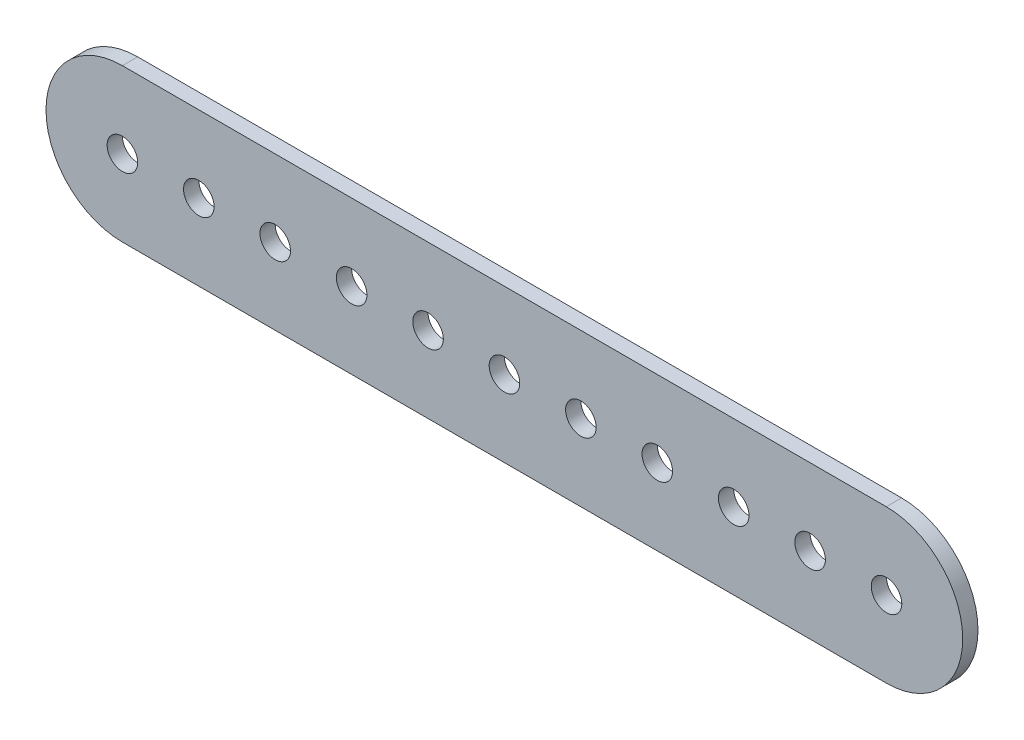
ISO-10303-21;
HEADER;
FILE_DESCRIPTION(('STEP AP214'),'2;1');
FILE_NAME('part.step','',(''),(''),'','','');
FILE_SCHEMA(('AUTOMOTIVE_DESIGN { 1 0 10303 214 1 1 1 1 }'));
ENDSEC;
DATA;
#1=APPLICATION_CONTEXT('core data for automotive mechanical design processes');
#2=APPLICATION_PROTOCOL_DEFINITION('international standard','automotive_design',2000,#1);
#3=PRODUCT_CONTEXT('',#1,'mechanical');
#4=PRODUCT('Part','Part','',(#3));
#5=PRODUCT_RELATED_PRODUCT_CATEGORY('part','',(#4));
#6=PRODUCT_DEFINITION_FORMATION('','',#4);
#7=PRODUCT_DEFINITION_CONTEXT('part definition',#1,'design');
#8=PRODUCT_DEFINITION('design','',#6,#7);
#9=PRODUCT_DEFINITION_SHAPE('','',#8);
#10=(LENGTH_UNIT() NAMED_UNIT(*) SI_UNIT(.MILLI.,.METRE.));
#11=(NAMED_UNIT(*) PLANE_ANGLE_UNIT() SI_UNIT($,.RADIAN.));
#12=(NAMED_UNIT(*) SI_UNIT($,.STERADIAN.) SOLID_ANGLE_UNIT());
#13=UNCERTAINTY_MEASURE_WITH_UNIT(LENGTH_MEASURE(1.E-05),#10,'distance_accuracy_value','');
#14=(GEOMETRIC_REPRESENTATION_CONTEXT(3) GLOBAL_UNCERTAINTY_ASSIGNED_CONTEXT((#13)) GLOBAL_UNIT_ASSIGNED_CONTEXT((#10,
#11,#12)) REPRESENTATION_CONTEXT('',''));
#15=CARTESIAN_POINT('',(0.,0.,0.));
#16=DIRECTION('',(0.,0.,1.));
#17=DIRECTION('',(1.,0.,0.));
#18=AXIS2_PLACEMENT_3D('',#15,#16,#17);
#19=CARTESIAN_POINT('',(0.,0.,100.));
#20=DIRECTION('',(0.,0.,1.));
#21=DIRECTION('',(1.,0.,0.));
#22=AXIS2_PLACEMENT_3D('',#19,#20,#21);
#23=PLANE('',#22);
#24=CARTESIAN_POINT('',(4501.134,0.,100.));
#25=DIRECTION('',(0.,0.,1.));
#26=DIRECTION('',(1.,0.,0.));
#27=AXIS2_PLACEMENT_3D('',#24,#25,#26);
#28=CIRCLE('',#27,100.);
#29=CARTESIAN_POINT('',(4601.134,0.,100.));
#30=VERTEX_POINT('',#29);
#31=EDGE_CURVE('E202',#30,#30,#28,.T.);
#32=ORIENTED_EDGE('',*,*,#31,.F.);
#33=EDGE_LOOP('',(#32));
#34=FACE_BOUND('',#33,.T.);
#35=CARTESIAN_POINT('',(3500.882,0.,100.));
#36=DIRECTION('',(0.,0.,1.));
#37=DIRECTION('',(1.,0.,0.));
#38=AXIS2_PLACEMENT_3D('',#35,#36,#37);
#39=CIRCLE('',#38,100.);
#40=CARTESIAN_POINT('',(3600.882,0.,100.));
#41=VERTEX_POINT('',#40);
#42=EDGE_CURVE('E186',#41,#41,#39,.T.);
#43=ORIENTED_EDGE('',*,*,#42,.F.);
#44=EDGE_LOOP('',(#43));
#45=FACE_BOUND('',#44,.T.);
#46=CARTESIAN_POINT('',(2500.63,0.,100.));
#47=DIRECTION('',(0.,0.,1.));
#48=DIRECTION('',(1.,0.,0.));
#49=AXIS2_PLACEMENT_3D('',#46,#47,#48);
#50=CIRCLE('',#49,100.);
#51=CARTESIAN_POINT('',(2600.63,0.,100.));
#52=VERTEX_POINT('',#51);
#53=EDGE_CURVE('E170',#52,#52,#50,.T.);
#54=ORIENTED_EDGE('',*,*,#53,.F.);
#55=EDGE_LOOP('',(#54));
#56=FACE_BOUND('',#55,.T.);
#57=CARTESIAN_POINT('',(1500.378,0.,100.));
#58=DIRECTION('',(0.,0.,1.));
#59=DIRECTION('',(1.,0.,0.));
#60=AXIS2_PLACEMENT_3D('',#57,#58,#59);
#61=CIRCLE('',#60,100.);
#62=CARTESIAN_POINT('',(1600.378,0.,100.));
#63=VERTEX_POINT('',#62);
#64=EDGE_CURVE('E154',#63,#63,#61,.T.);
#65=ORIENTED_EDGE('',*,*,#64,.F.);
#66=EDGE_LOOP('',(#65));
#67=FACE_BOUND('',#66,.T.);
#68=CARTESIAN_POINT('',(500.126,0.,100.));
#69=DIRECTION('',(0.,0.,1.));
#70=DIRECTION('',(1.,0.,0.));
#71=AXIS2_PLACEMENT_3D('',#68,#69,#70);
#72=CIRCLE('',#71,100.);
#73=CARTESIAN_POINT('',(600.126,0.,100.));
#74=VERTEX_POINT('',#73);
#75=EDGE_CURVE('E138',#74,#74,#72,.T.);
#76=ORIENTED_EDGE('',*,*,#75,.F.);
#77=EDGE_LOOP('',(#76));
#78=FACE_BOUND('',#77,.T.);
#79=CARTESIAN_POINT('',(0.,0.,100.));
#80=DIRECTION('',(0.,0.,1.));
#81=DIRECTION('',(1.,0.,0.));
#82=AXIS2_PLACEMENT_3D('',#79,#80,#81);
#83=CIRCLE('',#82,500.);
#84=CARTESIAN_POINT('',(0.,500.,100.));
#85=VERTEX_POINT('',#84);
#86=CARTESIAN_POINT('',(0.,-500.,100.));
#87=VERTEX_POINT('',#86);
#88=EDGE_CURVE('E96',#85,#87,#83,.T.);
#89=ORIENTED_EDGE('',*,*,#88,.T.);
#90=DIRECTION('',(1.,0.,0.));
#91=VECTOR('',#90,1.);
#92=CARTESIAN_POINT('',(0.,-500.,100.));
#93=LINE('',#92,#91);
#94=CARTESIAN_POINT('',(5000.,-500.,100.));
#95=VERTEX_POINT('',#94);
#96=EDGE_CURVE('E91',#87,#95,#93,.T.);
#97=ORIENTED_EDGE('',*,*,#96,.T.);
#98=CARTESIAN_POINT('',(5000.,0.,100.));
#99=DIRECTION('',(0.,0.,1.));
#100=DIRECTION('',(1.,0.,0.));
#101=AXIS2_PLACEMENT_3D('',#98,#99,#100);
#102=CIRCLE('',#101,500.);
#103=CARTESIAN_POINT('',(5000.,500.,100.));
#104=VERTEX_POINT('',#103);
#105=EDGE_CURVE('E94',#95,#104,#102,.T.);
#106=ORIENTED_EDGE('',*,*,#105,.T.);
#107=DIRECTION('',(-1.,0.,0.));
#108=VECTOR('',#107,1.);
#109=CARTESIAN_POINT('',(0.,500.,100.));
#110=LINE('',#109,#108);
#111=EDGE_CURVE('E61',#104,#85,#110,.T.);
#112=ORIENTED_EDGE('',*,*,#111,.T.);
#113=EDGE_LOOP('',(#89,#97,#106,#112));
#114=FACE_BOUND('',#113,.T.);
#115=CARTESIAN_POINT('',(0.,0.,100.));
#116=DIRECTION('',(0.,0.,1.));
#117=DIRECTION('',(1.,0.,0.));
#118=AXIS2_PLACEMENT_3D('',#115,#116,#117);
#119=CIRCLE('',#118,100.);
#120=CARTESIAN_POINT('',(100.,0.,100.));
#121=VERTEX_POINT('',#120);
#122=EDGE_CURVE('E116',#121,#121,#119,.T.);
#123=ORIENTED_EDGE('',*,*,#122,.F.);
#124=EDGE_LOOP('',(#123));
#125=FACE_BOUND('',#124,.T.);
#126=CARTESIAN_POINT('',(1000.252,0.,100.));
#127=DIRECTION('',(0.,0.,1.));
#128=DIRECTION('',(1.,0.,0.));
#129=AXIS2_PLACEMENT_3D('',#126,#127,#128);
#130=CIRCLE('',#129,100.);
#131=CARTESIAN_POINT('',(1100.252,0.,100.));
#132=VERTEX_POINT('',#131);
#133=EDGE_CURVE('E146',#132,#132,#130,.T.);
#134=ORIENTED_EDGE('',*,*,#133,.F.);
#135=EDGE_LOOP('',(#134));
#136=FACE_BOUND('',#135,.T.);
#137=CARTESIAN_POINT('',(2000.504,0.,100.));
#138=DIRECTION('',(0.,0.,1.));
#139=DIRECTION('',(1.,0.,0.));
#140=AXIS2_PLACEMENT_3D('',#137,#138,#139);
#141=CIRCLE('',#140,100.);
#142=CARTESIAN_POINT('',(2100.504,0.,100.));
#143=VERTEX_POINT('',#142);
#144=EDGE_CURVE('E162',#143,#143,#141,.T.);
#145=ORIENTED_EDGE('',*,*,#144,.F.);
#146=EDGE_LOOP('',(#145));
#147=FACE_BOUND('',#146,.T.);
#148=CARTESIAN_POINT('',(3000.756,0.,100.));
#149=DIRECTION('',(0.,0.,1.));
#150=DIRECTION('',(1.,0.,0.));
#151=AXIS2_PLACEMENT_3D('',#148,#149,#150);
#152=CIRCLE('',#151,100.);
#153=CARTESIAN_POINT('',(3100.756,0.,100.));
#154=VERTEX_POINT('',#153);
#155=EDGE_CURVE('E178',#154,#154,#152,.T.);
#156=ORIENTED_EDGE('',*,*,#155,.F.);
#157=EDGE_LOOP('',(#156));
#158=FACE_BOUND('',#157,.T.);
#159=CARTESIAN_POINT('',(4001.008,0.,100.));
#160=DIRECTION('',(0.,0.,1.));
#161=DIRECTION('',(1.,0.,0.));
#162=AXIS2_PLACEMENT_3D('',#159,#160,#161);
#163=CIRCLE('',#162,100.);
#164=CARTESIAN_POINT('',(4101.008,0.,100.));
#165=VERTEX_POINT('',#164);
#166=EDGE_CURVE('E194',#165,#165,#163,.T.);
#167=ORIENTED_EDGE('',*,*,#166,.F.);
#168=EDGE_LOOP('',(#167));
#169=FACE_BOUND('',#168,.T.);
#170=CARTESIAN_POINT('',(5001.26,0.,100.));
#171=DIRECTION('',(0.,0.,1.));
#172=DIRECTION('',(1.,0.,0.));
#173=AXIS2_PLACEMENT_3D('',#170,#171,#172);
#174=CIRCLE('',#173,100.);
#175=CARTESIAN_POINT('',(5101.26,0.,100.));
#176=VERTEX_POINT('',#175);
#177=EDGE_CURVE('E210',#176,#176,#174,.T.);
#178=ORIENTED_EDGE('',*,*,#177,.F.);
#179=EDGE_LOOP('',(#178));
#180=FACE_BOUND('',#179,.T.);
#181=ADVANCED_FACE('F43',(#34,#45,#56,#67,#78,#114,#125,#136,#147,#158,#169,#180),#23,.T.);
#182=CARTESIAN_POINT('',(0.,0.,0.));
#183=DIRECTION('',(0.,0.,1.));
#184=DIRECTION('',(1.,0.,0.));
#185=AXIS2_PLACEMENT_3D('',#182,#183,#184);
#186=PLANE('',#185);
#187=CARTESIAN_POINT('',(0.,0.,0.));
#188=DIRECTION('',(0.,0.,1.));
#189=DIRECTION('',(1.,0.,0.));
#190=AXIS2_PLACEMENT_3D('',#187,#188,#189);
#191=CIRCLE('',#190,500.);
#192=CARTESIAN_POINT('',(0.,500.,0.));
#193=VERTEX_POINT('',#192);
#194=CARTESIAN_POINT('',(0.,-500.,0.));
#195=VERTEX_POINT('',#194);
#196=EDGE_CURVE('E112',#193,#195,#191,.T.);
#197=ORIENTED_EDGE('',*,*,#196,.F.);
#198=DIRECTION('',(-1.,0.,0.));
#199=VECTOR('',#198,1.);
#200=CARTESIAN_POINT('',(0.,500.,0.));
#201=LINE('',#200,#199);
#202=CARTESIAN_POINT('',(5000.,500.,0.));
#203=VERTEX_POINT('',#202);
#204=EDGE_CURVE('E84',#203,#193,#201,.T.);
#205=ORIENTED_EDGE('',*,*,#204,.F.);
#206=CARTESIAN_POINT('',(5000.,0.,0.));
#207=DIRECTION('',(0.,0.,1.));
#208=DIRECTION('',(1.,0.,0.));
#209=AXIS2_PLACEMENT_3D('',#206,#207,#208);
#210=CIRCLE('',#209,500.);
#211=CARTESIAN_POINT('',(5000.,-500.,0.));
#212=VERTEX_POINT('',#211);
#213=EDGE_CURVE('E78',#212,#203,#210,.T.);
#214=ORIENTED_EDGE('',*,*,#213,.F.);
#215=DIRECTION('',(1.,0.,0.));
#216=VECTOR('',#215,1.);
#217=CARTESIAN_POINT('',(0.,-500.,0.));
#218=LINE('',#217,#216);
#219=EDGE_CURVE('E101',#195,#212,#218,.T.);
#220=ORIENTED_EDGE('',*,*,#219,.F.);
#221=EDGE_LOOP('',(#197,#205,#214,#220));
#222=FACE_BOUND('',#221,.T.);
#223=CARTESIAN_POINT('',(0.,0.,0.));
#224=DIRECTION('',(0.,0.,1.));
#225=DIRECTION('',(1.,0.,0.));
#226=AXIS2_PLACEMENT_3D('',#223,#224,#225);
#227=CIRCLE('',#226,100.);
#228=CARTESIAN_POINT('',(100.,0.,0.));
#229=VERTEX_POINT('',#228);
#230=EDGE_CURVE('E134',#229,#229,#227,.T.);
#231=ORIENTED_EDGE('',*,*,#230,.T.);
#232=EDGE_LOOP('',(#231));
#233=FACE_BOUND('',#232,.T.);
#234=CARTESIAN_POINT('',(500.126,0.,0.));
#235=DIRECTION('',(0.,0.,1.));
#236=DIRECTION('',(1.,0.,0.));
#237=AXIS2_PLACEMENT_3D('',#234,#235,#236);
#238=CIRCLE('',#237,100.);
#239=CARTESIAN_POINT('',(600.126,0.,0.));
#240=VERTEX_POINT('',#239);
#241=EDGE_CURVE('E142',#240,#240,#238,.T.);
#242=ORIENTED_EDGE('',*,*,#241,.T.);
#243=EDGE_LOOP('',(#242));
#244=FACE_BOUND('',#243,.T.);
#245=CARTESIAN_POINT('',(1000.252,0.,0.));
#246=DIRECTION('',(0.,0.,1.));
#247=DIRECTION('',(1.,0.,0.));
#248=AXIS2_PLACEMENT_3D('',#245,#246,#247);
#249=CIRCLE('',#248,100.);
#250=CARTESIAN_POINT('',(1100.252,0.,0.));
#251=VERTEX_POINT('',#250);
#252=EDGE_CURVE('E150',#251,#251,#249,.T.);
#253=ORIENTED_EDGE('',*,*,#252,.T.);
#254=EDGE_LOOP('',(#253));
#255=FACE_BOUND('',#254,.T.);
#256=CARTESIAN_POINT('',(1500.378,0.,0.));
#257=DIRECTION('',(0.,0.,1.));
#258=DIRECTION('',(1.,0.,0.));
#259=AXIS2_PLACEMENT_3D('',#256,#257,#258);
#260=CIRCLE('',#259,100.);
#261=CARTESIAN_POINT('',(1600.378,0.,0.));
#262=VERTEX_POINT('',#261);
#263=EDGE_CURVE('E158',#262,#262,#260,.T.);
#264=ORIENTED_EDGE('',*,*,#263,.T.);
#265=EDGE_LOOP('',(#264));
#266=FACE_BOUND('',#265,.T.);
#267=CARTESIAN_POINT('',(2000.504,0.,0.));
#268=DIRECTION('',(0.,0.,1.));
#269=DIRECTION('',(1.,0.,0.));
#270=AXIS2_PLACEMENT_3D('',#267,#268,#269);
#271=CIRCLE('',#270,100.);
#272=CARTESIAN_POINT('',(2100.504,0.,0.));
#273=VERTEX_POINT('',#272);
#274=EDGE_CURVE('E166',#273,#273,#271,.T.);
#275=ORIENTED_EDGE('',*,*,#274,.T.);
#276=EDGE_LOOP('',(#275));
#277=FACE_BOUND('',#276,.T.);
#278=CARTESIAN_POINT('',(2500.63,0.,0.));
#279=DIRECTION('',(0.,0.,1.));
#280=DIRECTION('',(1.,0.,0.));
#281=AXIS2_PLACEMENT_3D('',#278,#279,#280);
#282=CIRCLE('',#281,100.);
#283=CARTESIAN_POINT('',(2600.63,0.,0.));
#284=VERTEX_POINT('',#283);
#285=EDGE_CURVE('E174',#284,#284,#282,.T.);
#286=ORIENTED_EDGE('',*,*,#285,.T.);
#287=EDGE_LOOP('',(#286));
#288=FACE_BOUND('',#287,.T.);
#289=CARTESIAN_POINT('',(3000.756,0.,0.));
#290=DIRECTION('',(0.,0.,1.));
#291=DIRECTION('',(1.,0.,0.));
#292=AXIS2_PLACEMENT_3D('',#289,#290,#291);
#293=CIRCLE('',#292,100.);
#294=CARTESIAN_POINT('',(3100.756,0.,0.));
#295=VERTEX_POINT('',#294);
#296=EDGE_CURVE('E182',#295,#295,#293,.T.);
#297=ORIENTED_EDGE('',*,*,#296,.T.);
#298=EDGE_LOOP('',(#297));
#299=FACE_BOUND('',#298,.T.);
#300=CARTESIAN_POINT('',(3500.882,0.,0.));
#301=DIRECTION('',(0.,0.,1.));
#302=DIRECTION('',(1.,0.,0.));
#303=AXIS2_PLACEMENT_3D('',#300,#301,#302);
#304=CIRCLE('',#303,100.);
#305=CARTESIAN_POINT('',(3600.882,0.,0.));
#306=VERTEX_POINT('',#305);
#307=EDGE_CURVE('E190',#306,#306,#304,.T.);
#308=ORIENTED_EDGE('',*,*,#307,.T.);
#309=EDGE_LOOP('',(#308));
#310=FACE_BOUND('',#309,.T.);
#311=CARTESIAN_POINT('',(4001.008,0.,0.));
#312=DIRECTION('',(0.,0.,1.));
#313=DIRECTION('',(1.,0.,0.));
#314=AXIS2_PLACEMENT_3D('',#311,#312,#313);
#315=CIRCLE('',#314,100.);
#316=CARTESIAN_POINT('',(4101.008,0.,0.));
#317=VERTEX_POINT('',#316);
#318=EDGE_CURVE('E198',#317,#317,#315,.T.);
#319=ORIENTED_EDGE('',*,*,#318,.T.);
#320=EDGE_LOOP('',(#319));
#321=FACE_BOUND('',#320,.T.);
#322=CARTESIAN_POINT('',(4501.134,0.,0.));
#323=DIRECTION('',(0.,0.,1.));
#324=DIRECTION('',(1.,0.,0.));
#325=AXIS2_PLACEMENT_3D('',#322,#323,#324);
#326=CIRCLE('',#325,100.);
#327=CARTESIAN_POINT('',(4601.134,0.,0.));
#328=VERTEX_POINT('',#327);
#329=EDGE_CURVE('E206',#328,#328,#326,.T.);
#330=ORIENTED_EDGE('',*,*,#329,.T.);
#331=EDGE_LOOP('',(#330));
#332=FACE_BOUND('',#331,.T.);
#333=CARTESIAN_POINT('',(5001.26,0.,0.));
#334=DIRECTION('',(0.,0.,1.));
#335=DIRECTION('',(1.,0.,0.));
#336=AXIS2_PLACEMENT_3D('',#333,#334,#335);
#337=CIRCLE('',#336,100.);
#338=CARTESIAN_POINT('',(5101.26,0.,0.));
#339=VERTEX_POINT('',#338);
#340=EDGE_CURVE('E214',#339,#339,#337,.T.);
#341=ORIENTED_EDGE('',*,*,#340,.T.);
#342=EDGE_LOOP('',(#341));
#343=FACE_BOUND('',#342,.T.);
#344=ADVANCED_FACE('F129',(#222,#233,#244,#255,#266,#277,#288,#299,#310,#321,#332,#343),#186,.F.);
#345=CARTESIAN_POINT('',(0.,0.,100.));
#346=DIRECTION('',(0.,0.,-1.));
#347=DIRECTION('',(-1.,0.,0.));
#348=AXIS2_PLACEMENT_3D('',#345,#346,#347);
#349=CYLINDRICAL_SURFACE('',#348,500.);
#350=ORIENTED_EDGE('',*,*,#196,.T.);
#351=DIRECTION('',(0.,0.,-1.));
#352=VECTOR('',#351,1.);
#353=CARTESIAN_POINT('',(0.,-500.,100.));
#354=LINE('',#353,#352);
#355=EDGE_CURVE('E11',#87,#195,#354,.T.);
#356=ORIENTED_EDGE('',*,*,#355,.F.);
#357=ORIENTED_EDGE('',*,*,#88,.F.);
#358=DIRECTION('',(0.,0.,-1.));
#359=VECTOR('',#358,1.);
#360=CARTESIAN_POINT('',(0.,500.,100.));
#361=LINE('',#360,#359);
#362=EDGE_CURVE('E108',#85,#193,#361,.T.);
#363=ORIENTED_EDGE('',*,*,#362,.T.);
#364=EDGE_LOOP('',(#350,#356,#357,#363));
#365=FACE_BOUND('',#364,.T.);
#366=ADVANCED_FACE('F45',(#365),#349,.T.);
#367=CARTESIAN_POINT('',(0.,-500.,100.));
#368=DIRECTION('',(0.,1.,0.));
#369=DIRECTION('',(0.,0.,1.));
#370=AXIS2_PLACEMENT_3D('',#367,#368,#369);
#371=PLANE('',#370);
#372=ORIENTED_EDGE('',*,*,#219,.T.);
#373=DIRECTION('',(0.,0.,-1.));
#374=VECTOR('',#373,1.);
#375=CARTESIAN_POINT('',(5000.,-500.,100.));
#376=LINE('',#375,#374);
#377=EDGE_CURVE('E53',#95,#212,#376,.T.);
#378=ORIENTED_EDGE('',*,*,#377,.F.);
#379=ORIENTED_EDGE('',*,*,#96,.F.);
#380=ORIENTED_EDGE('',*,*,#355,.T.);
#381=EDGE_LOOP('',(#372,#378,#379,#380));
#382=FACE_BOUND('',#381,.T.);
#383=ADVANCED_FACE('F100',(#382),#371,.F.);
#384=CARTESIAN_POINT('',(5000.,0.,100.));
#385=DIRECTION('',(0.,0.,-1.));
#386=DIRECTION('',(-1.,0.,0.));
#387=AXIS2_PLACEMENT_3D('',#384,#385,#386);
#388=CYLINDRICAL_SURFACE('',#387,500.);
#389=ORIENTED_EDGE('',*,*,#213,.T.);
#390=DIRECTION('',(0.,0.,-1.));
#391=VECTOR('',#390,1.);
#392=CARTESIAN_POINT('',(5000.,500.,100.));
#393=LINE('',#392,#391);
#394=EDGE_CURVE('E103',#104,#203,#393,.T.);
#395=ORIENTED_EDGE('',*,*,#394,.F.);
#396=ORIENTED_EDGE('',*,*,#105,.F.);
#397=ORIENTED_EDGE('',*,*,#377,.T.);
#398=EDGE_LOOP('',(#389,#395,#396,#397));
#399=FACE_BOUND('',#398,.T.);
#400=ADVANCED_FACE('F104',(#399),#388,.T.);
#401=CARTESIAN_POINT('',(0.,500.,100.));
#402=DIRECTION('',(0.,-1.,0.));
#403=DIRECTION('',(0.,0.,-1.));
#404=AXIS2_PLACEMENT_3D('',#401,#402,#403);
#405=PLANE('',#404);
#406=ORIENTED_EDGE('',*,*,#204,.T.);
#407=ORIENTED_EDGE('',*,*,#362,.F.);
#408=ORIENTED_EDGE('',*,*,#111,.F.);
#409=ORIENTED_EDGE('',*,*,#394,.T.);
#410=EDGE_LOOP('',(#406,#407,#408,#409));
#411=FACE_BOUND('',#410,.T.);
#412=ADVANCED_FACE('F126',(#411),#405,.F.);
#413=CARTESIAN_POINT('',(0.,0.,100.));
#414=DIRECTION('',(0.,0.,-1.));
#415=DIRECTION('',(-1.,0.,0.));
#416=AXIS2_PLACEMENT_3D('',#413,#414,#415);
#417=CYLINDRICAL_SURFACE('',#416,100.);
#418=ORIENTED_EDGE('',*,*,#122,.T.);
#419=EDGE_LOOP('',(#418));
#420=FACE_BOUND('',#419,.T.);
#421=ORIENTED_EDGE('',*,*,#230,.F.);
#422=EDGE_LOOP('',(#421));
#423=FACE_BOUND('',#422,.T.);
#424=ADVANCED_FACE('F235',(#420,#423),#417,.F.);
#425=CARTESIAN_POINT('',(500.126,0.,100.));
#426=DIRECTION('',(0.,0.,-1.));
#427=DIRECTION('',(-1.,0.,0.));
#428=AXIS2_PLACEMENT_3D('',#425,#426,#427);
#429=CYLINDRICAL_SURFACE('',#428,100.);
#430=ORIENTED_EDGE('',*,*,#75,.T.);
#431=EDGE_LOOP('',(#430));
#432=FACE_BOUND('',#431,.T.);
#433=ORIENTED_EDGE('',*,*,#241,.F.);
#434=EDGE_LOOP('',(#433));
#435=FACE_BOUND('',#434,.T.);
#436=ADVANCED_FACE('F289',(#432,#435),#429,.F.);
#437=CARTESIAN_POINT('',(1000.252,0.,100.));
#438=DIRECTION('',(0.,0.,-1.));
#439=DIRECTION('',(-1.,0.,0.));
#440=AXIS2_PLACEMENT_3D('',#437,#438,#439);
#441=CYLINDRICAL_SURFACE('',#440,100.);
#442=ORIENTED_EDGE('',*,*,#133,.T.);
#443=EDGE_LOOP('',(#442));
#444=FACE_BOUND('',#443,.T.);
#445=ORIENTED_EDGE('',*,*,#252,.F.);
#446=EDGE_LOOP('',(#445));
#447=FACE_BOUND('',#446,.T.);
#448=ADVANCED_FACE('F298',(#444,#447),#441,.F.);
#449=CARTESIAN_POINT('',(1500.378,0.,100.));
#450=DIRECTION('',(0.,0.,-1.));
#451=DIRECTION('',(-1.,0.,0.));
#452=AXIS2_PLACEMENT_3D('',#449,#450,#451);
#453=CYLINDRICAL_SURFACE('',#452,100.);
#454=ORIENTED_EDGE('',*,*,#64,.T.);
#455=EDGE_LOOP('',(#454));
#456=FACE_BOUND('',#455,.T.);
#457=ORIENTED_EDGE('',*,*,#263,.F.);
#458=EDGE_LOOP('',(#457));
#459=FACE_BOUND('',#458,.T.);
#460=ADVANCED_FACE('F307',(#456,#459),#453,.F.);
#461=CARTESIAN_POINT('',(2000.504,0.,100.));
#462=DIRECTION('',(0.,0.,-1.));
#463=DIRECTION('',(-1.,0.,0.));
#464=AXIS2_PLACEMENT_3D('',#461,#462,#463);
#465=CYLINDRICAL_SURFACE('',#464,100.);
#466=ORIENTED_EDGE('',*,*,#144,.T.);
#467=EDGE_LOOP('',(#466));
#468=FACE_BOUND('',#467,.T.);
#469=ORIENTED_EDGE('',*,*,#274,.F.);
#470=EDGE_LOOP('',(#469));
#471=FACE_BOUND('',#470,.T.);
#472=ADVANCED_FACE('F317',(#468,#471),#465,.F.);
#473=CARTESIAN_POINT('',(2500.63,0.,100.));
#474=DIRECTION('',(0.,0.,-1.));
#475=DIRECTION('',(-1.,0.,0.));
#476=AXIS2_PLACEMENT_3D('',#473,#474,#475);
#477=CYLINDRICAL_SURFACE('',#476,100.);
#478=ORIENTED_EDGE('',*,*,#53,.T.);
#479=EDGE_LOOP('',(#478));
#480=FACE_BOUND('',#479,.T.);
#481=ORIENTED_EDGE('',*,*,#285,.F.);
#482=EDGE_LOOP('',(#481));
#483=FACE_BOUND('',#482,.T.);
#484=ADVANCED_FACE('F327',(#480,#483),#477,.F.);
#485=CARTESIAN_POINT('',(3000.756,0.,100.));
#486=DIRECTION('',(0.,0.,-1.));
#487=DIRECTION('',(-1.,0.,0.));
#488=AXIS2_PLACEMENT_3D('',#485,#486,#487);
#489=CYLINDRICAL_SURFACE('',#488,100.);
#490=ORIENTED_EDGE('',*,*,#155,.T.);
#491=EDGE_LOOP('',(#490));
#492=FACE_BOUND('',#491,.T.);
#493=ORIENTED_EDGE('',*,*,#296,.F.);
#494=EDGE_LOOP('',(#493));
#495=FACE_BOUND('',#494,.T.);
#496=ADVANCED_FACE('F337',(#492,#495),#489,.F.);
#497=CARTESIAN_POINT('',(3500.882,0.,100.));
#498=DIRECTION('',(0.,0.,-1.));
#499=DIRECTION('',(-1.,0.,0.));
#500=AXIS2_PLACEMENT_3D('',#497,#498,#499);
#501=CYLINDRICAL_SURFACE('',#500,100.);
#502=ORIENTED_EDGE('',*,*,#42,.T.);
#503=EDGE_LOOP('',(#502));
#504=FACE_BOUND('',#503,.T.);
#505=ORIENTED_EDGE('',*,*,#307,.F.);
#506=EDGE_LOOP('',(#505));
#507=FACE_BOUND('',#506,.T.);
#508=ADVANCED_FACE('F347',(#504,#507),#501,.F.);
#509=CARTESIAN_POINT('',(4001.008,0.,100.));
#510=DIRECTION('',(0.,0.,-1.));
#511=DIRECTION('',(-1.,0.,0.));
#512=AXIS2_PLACEMENT_3D('',#509,#510,#511);
#513=CYLINDRICAL_SURFACE('',#512,100.);
#514=ORIENTED_EDGE('',*,*,#166,.T.);
#515=EDGE_LOOP('',(#514));
#516=FACE_BOUND('',#515,.T.);
#517=ORIENTED_EDGE('',*,*,#318,.F.);
#518=EDGE_LOOP('',(#517));
#519=FACE_BOUND('',#518,.T.);
#520=ADVANCED_FACE('F357',(#516,#519),#513,.F.);
#521=CARTESIAN_POINT('',(4501.134,0.,100.));
#522=DIRECTION('',(0.,0.,-1.));
#523=DIRECTION('',(-1.,0.,0.));
#524=AXIS2_PLACEMENT_3D('',#521,#522,#523);
#525=CYLINDRICAL_SURFACE('',#524,100.);
#526=ORIENTED_EDGE('',*,*,#31,.T.);
#527=EDGE_LOOP('',(#526));
#528=FACE_BOUND('',#527,.T.);
#529=ORIENTED_EDGE('',*,*,#329,.F.);
#530=EDGE_LOOP('',(#529));
#531=FACE_BOUND('',#530,.T.);
#532=ADVANCED_FACE('F367',(#528,#531),#525,.F.);
#533=CARTESIAN_POINT('',(5001.26,0.,100.));
#534=DIRECTION('',(0.,0.,-1.));
#535=DIRECTION('',(-1.,0.,0.));
#536=AXIS2_PLACEMENT_3D('',#533,#534,#535);
#537=CYLINDRICAL_SURFACE('',#536,100.);
#538=ORIENTED_EDGE('',*,*,#177,.T.);
#539=EDGE_LOOP('',(#538));
#540=FACE_BOUND('',#539,.T.);
#541=ORIENTED_EDGE('',*,*,#340,.F.);
#542=EDGE_LOOP('',(#541));
#543=FACE_BOUND('',#542,.T.);
#544=ADVANCED_FACE('F222',(#540,#543),#537,.F.);
#545=CLOSED_SHELL('',(#181,#344,#366,#383,#400,#412,#424,#436,#448,#460,#472,#484,#496,#508,
#520,#532,#544));
#546=MANIFOLD_SOLID_BREP('B2',#545);
#547=ADVANCED_BREP_SHAPE_REPRESENTATION('',(#18,#546),#14);
#548=SHAPE_DEFINITION_REPRESENTATION(#9,#547);
ENDSEC;
END-ISO-10303-21;
